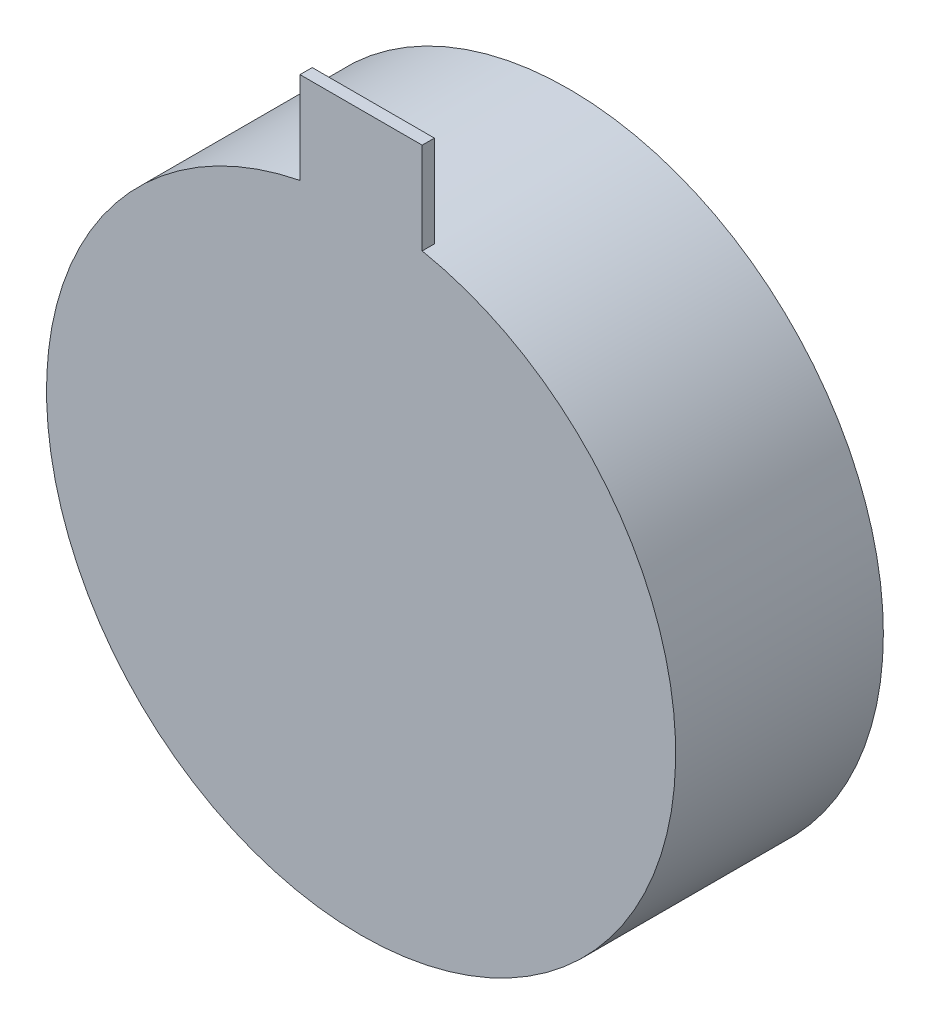
ISO-10303-21;
HEADER;
FILE_DESCRIPTION(('STEP AP214'),'2;1');
FILE_NAME('part.step','',(''),(''),'','','');
FILE_SCHEMA(('AUTOMOTIVE_DESIGN { 1 0 10303 214 1 1 1 1 }'));
ENDSEC;
DATA;
#1=APPLICATION_CONTEXT('core data for automotive mechanical design processes');
#2=APPLICATION_PROTOCOL_DEFINITION('international standard','automotive_design',2000,#1);
#3=PRODUCT_CONTEXT('',#1,'mechanical');
#4=PRODUCT('Part','Part','',(#3));
#5=PRODUCT_RELATED_PRODUCT_CATEGORY('part','',(#4));
#6=PRODUCT_DEFINITION_FORMATION('','',#4);
#7=PRODUCT_DEFINITION_CONTEXT('part definition',#1,'design');
#8=PRODUCT_DEFINITION('design','',#6,#7);
#9=PRODUCT_DEFINITION_SHAPE('','',#8);
#10=(LENGTH_UNIT() NAMED_UNIT(*) SI_UNIT(.MILLI.,.METRE.));
#11=(NAMED_UNIT(*) PLANE_ANGLE_UNIT() SI_UNIT($,.RADIAN.));
#12=(NAMED_UNIT(*) SI_UNIT($,.STERADIAN.) SOLID_ANGLE_UNIT());
#13=UNCERTAINTY_MEASURE_WITH_UNIT(LENGTH_MEASURE(1.E-05),#10,'distance_accuracy_value','');
#14=(GEOMETRIC_REPRESENTATION_CONTEXT(3) GLOBAL_UNCERTAINTY_ASSIGNED_CONTEXT((#13)) GLOBAL_UNIT_ASSIGNED_CONTEXT((#10,
#11,#12)) REPRESENTATION_CONTEXT('',''));
#15=CARTESIAN_POINT('',(0.,0.,0.));
#16=DIRECTION('',(0.,0.,1.));
#17=DIRECTION('',(1.,0.,0.));
#18=AXIS2_PLACEMENT_3D('',#15,#16,#17);
#19=CARTESIAN_POINT('',(0.,0.,3.4));
#20=DIRECTION('',(0.,0.,-1.));
#21=DIRECTION('',(-1.,0.,0.));
#22=AXIS2_PLACEMENT_3D('',#19,#20,#21);
#23=CYLINDRICAL_SURFACE('',#22,5.15);
#24=CARTESIAN_POINT('',(0.,0.,0.));
#25=DIRECTION('',(0.,0.,1.));
#26=DIRECTION('',(1.,0.,0.));
#27=AXIS2_PLACEMENT_3D('',#24,#25,#26);
#28=CIRCLE('',#27,5.15);
#29=CARTESIAN_POINT('',(5.15,0.,0.));
#30=VERTEX_POINT('',#29);
#31=EDGE_CURVE('E103',#30,#30,#28,.T.);
#32=ORIENTED_EDGE('',*,*,#31,.T.);
#33=EDGE_LOOP('',(#32));
#34=FACE_BOUND('',#33,.T.);
#35=DIRECTION('',(0.,0.,1.));
#36=VECTOR('',#35,1.);
#37=CARTESIAN_POINT('',(1.,5.0519798099359,3.2));
#38=LINE('',#37,#36);
#39=CARTESIAN_POINT('',(1.,5.0519798099359,3.2));
#40=VERTEX_POINT('',#39);
#41=CARTESIAN_POINT('',(1.,5.0519798099359,3.4));
#42=VERTEX_POINT('',#41);
#43=EDGE_CURVE('E90',#40,#42,#38,.T.);
#44=ORIENTED_EDGE('',*,*,#43,.T.);
#45=CARTESIAN_POINT('',(0.,0.,3.4));
#46=DIRECTION('',(0.,0.,1.));
#47=DIRECTION('',(1.,0.,0.));
#48=AXIS2_PLACEMENT_3D('',#45,#46,#47);
#49=CIRCLE('',#48,5.15);
#50=CARTESIAN_POINT('',(-0.999999999999999,5.0519798099359,3.4));
#51=VERTEX_POINT('',#50);
#52=EDGE_CURVE('E40',#51,#42,#49,.T.);
#53=ORIENTED_EDGE('',*,*,#52,.F.);
#54=DIRECTION('',(0.,0.,1.));
#55=VECTOR('',#54,1.);
#56=CARTESIAN_POINT('',(-1.,5.0519798099359,3.2));
#57=LINE('',#56,#55);
#58=CARTESIAN_POINT('',(-1.,5.0519798099359,3.2));
#59=VERTEX_POINT('',#58);
#60=EDGE_CURVE('E93',#59,#51,#57,.T.);
#61=ORIENTED_EDGE('',*,*,#60,.F.);
#62=CARTESIAN_POINT('',(0.,0.,3.2));
#63=DIRECTION('',(0.,0.,-1.));
#64=DIRECTION('',(-1.,0.,0.));
#65=AXIS2_PLACEMENT_3D('',#62,#63,#64);
#66=CIRCLE('',#65,5.15);
#67=EDGE_CURVE('E11',#59,#40,#66,.T.);
#68=ORIENTED_EDGE('',*,*,#67,.T.);
#69=EDGE_LOOP('',(#44,#53,#61,#68));
#70=FACE_BOUND('',#69,.T.);
#71=ADVANCED_FACE('F33',(#34,#70),#23,.T.);
#72=CARTESIAN_POINT('',(0.,0.,3.4));
#73=DIRECTION('',(0.,0.,1.));
#74=DIRECTION('',(1.,0.,0.));
#75=AXIS2_PLACEMENT_3D('',#72,#73,#74);
#76=PLANE('',#75);
#77=ORIENTED_EDGE('',*,*,#52,.T.);
#78=DIRECTION('',(0.,-1.,0.));
#79=VECTOR('',#78,1.);
#80=CARTESIAN_POINT('',(1.,6.5519798099359,3.4));
#81=LINE('',#80,#79);
#82=CARTESIAN_POINT('',(1.,6.5519798099359,3.4));
#83=VERTEX_POINT('',#82);
#84=EDGE_CURVE('E71',#83,#42,#81,.T.);
#85=ORIENTED_EDGE('',*,*,#84,.F.);
#86=DIRECTION('',(1.,0.,0.));
#87=VECTOR('',#86,1.);
#88=CARTESIAN_POINT('',(-1.,6.5519798099359,3.4));
#89=LINE('',#88,#87);
#90=CARTESIAN_POINT('',(-1.,6.5519798099359,3.4));
#91=VERTEX_POINT('',#90);
#92=EDGE_CURVE('E88',#91,#83,#89,.T.);
#93=ORIENTED_EDGE('',*,*,#92,.F.);
#94=DIRECTION('',(0.,1.,0.));
#95=VECTOR('',#94,1.);
#96=CARTESIAN_POINT('',(-1.,5.0519798099359,3.4));
#97=LINE('',#96,#95);
#98=EDGE_CURVE('E47',#51,#91,#97,.T.);
#99=ORIENTED_EDGE('',*,*,#98,.F.);
#100=EDGE_LOOP('',(#77,#85,#93,#99));
#101=FACE_BOUND('',#100,.T.);
#102=ADVANCED_FACE('F111',(#101),#76,.T.);
#103=CARTESIAN_POINT('',(0.,0.,0.));
#104=DIRECTION('',(0.,0.,1.));
#105=DIRECTION('',(1.,0.,0.));
#106=AXIS2_PLACEMENT_3D('',#103,#104,#105);
#107=PLANE('',#106);
#108=ORIENTED_EDGE('',*,*,#31,.F.);
#109=EDGE_LOOP('',(#108));
#110=FACE_BOUND('',#109,.T.);
#111=ADVANCED_FACE('F109',(#110),#107,.F.);
#112=CARTESIAN_POINT('',(0.,0.,3.2));
#113=DIRECTION('',(0.,0.,-1.));
#114=DIRECTION('',(-1.,0.,0.));
#115=AXIS2_PLACEMENT_3D('',#112,#113,#114);
#116=PLANE('',#115);
#117=ORIENTED_EDGE('',*,*,#67,.F.);
#118=DIRECTION('',(0.,1.,0.));
#119=VECTOR('',#118,1.);
#120=CARTESIAN_POINT('',(-1.,5.0519798099359,3.2));
#121=LINE('',#120,#119);
#122=CARTESIAN_POINT('',(-1.,6.5519798099359,3.2));
#123=VERTEX_POINT('',#122);
#124=EDGE_CURVE('E83',#59,#123,#121,.T.);
#125=ORIENTED_EDGE('',*,*,#124,.T.);
#126=DIRECTION('',(1.,0.,0.));
#127=VECTOR('',#126,1.);
#128=CARTESIAN_POINT('',(-1.,6.5519798099359,3.2));
#129=LINE('',#128,#127);
#130=CARTESIAN_POINT('',(1.,6.5519798099359,3.2));
#131=VERTEX_POINT('',#130);
#132=EDGE_CURVE('E79',#123,#131,#129,.T.);
#133=ORIENTED_EDGE('',*,*,#132,.T.);
#134=DIRECTION('',(0.,-1.,0.));
#135=VECTOR('',#134,1.);
#136=CARTESIAN_POINT('',(1.,6.5519798099359,3.2));
#137=LINE('',#136,#135);
#138=EDGE_CURVE('E82',#131,#40,#137,.T.);
#139=ORIENTED_EDGE('',*,*,#138,.T.);
#140=EDGE_LOOP('',(#117,#125,#133,#139));
#141=FACE_BOUND('',#140,.T.);
#142=ADVANCED_FACE('F80',(#141),#116,.T.);
#143=CARTESIAN_POINT('',(-1.,5.0519798099359,3.2));
#144=DIRECTION('',(1.,0.,0.));
#145=DIRECTION('',(0.,0.,-1.));
#146=AXIS2_PLACEMENT_3D('',#143,#144,#145);
#147=PLANE('',#146);
#148=ORIENTED_EDGE('',*,*,#98,.T.);
#149=DIRECTION('',(0.,0.,1.));
#150=VECTOR('',#149,1.);
#151=CARTESIAN_POINT('',(-1.,6.5519798099359,3.2));
#152=LINE('',#151,#150);
#153=EDGE_CURVE('E89',#123,#91,#152,.T.);
#154=ORIENTED_EDGE('',*,*,#153,.F.);
#155=ORIENTED_EDGE('',*,*,#124,.F.);
#156=ORIENTED_EDGE('',*,*,#60,.T.);
#157=EDGE_LOOP('',(#148,#154,#155,#156));
#158=FACE_BOUND('',#157,.T.);
#159=ADVANCED_FACE('F116',(#158),#147,.F.);
#160=CARTESIAN_POINT('',(-1.,6.5519798099359,3.2));
#161=DIRECTION('',(0.,-1.,0.));
#162=DIRECTION('',(1.,0.,0.));
#163=AXIS2_PLACEMENT_3D('',#160,#161,#162);
#164=PLANE('',#163);
#165=ORIENTED_EDGE('',*,*,#92,.T.);
#166=DIRECTION('',(0.,0.,1.));
#167=VECTOR('',#166,1.);
#168=CARTESIAN_POINT('',(1.,6.5519798099359,3.2));
#169=LINE('',#168,#167);
#170=EDGE_CURVE('E86',#131,#83,#169,.T.);
#171=ORIENTED_EDGE('',*,*,#170,.F.);
#172=ORIENTED_EDGE('',*,*,#132,.F.);
#173=ORIENTED_EDGE('',*,*,#153,.T.);
#174=EDGE_LOOP('',(#165,#171,#172,#173));
#175=FACE_BOUND('',#174,.T.);
#176=ADVANCED_FACE('F87',(#175),#164,.F.);
#177=CARTESIAN_POINT('',(1.,6.5519798099359,3.2));
#178=DIRECTION('',(-1.,0.,0.));
#179=DIRECTION('',(0.,0.,1.));
#180=AXIS2_PLACEMENT_3D('',#177,#178,#179);
#181=PLANE('',#180);
#182=ORIENTED_EDGE('',*,*,#84,.T.);
#183=ORIENTED_EDGE('',*,*,#43,.F.);
#184=ORIENTED_EDGE('',*,*,#138,.F.);
#185=ORIENTED_EDGE('',*,*,#170,.T.);
#186=EDGE_LOOP('',(#182,#183,#184,#185));
#187=FACE_BOUND('',#186,.T.);
#188=ADVANCED_FACE('F92',(#187),#181,.F.);
#189=CLOSED_SHELL('',(#71,#102,#111,#142,#159,#176,#188));
#190=MANIFOLD_SOLID_BREP('B2',#189);
#191=ADVANCED_BREP_SHAPE_REPRESENTATION('',(#18,#190),#14);
#192=SHAPE_DEFINITION_REPRESENTATION(#9,#191);
ENDSEC;
END-ISO-10303-21;
